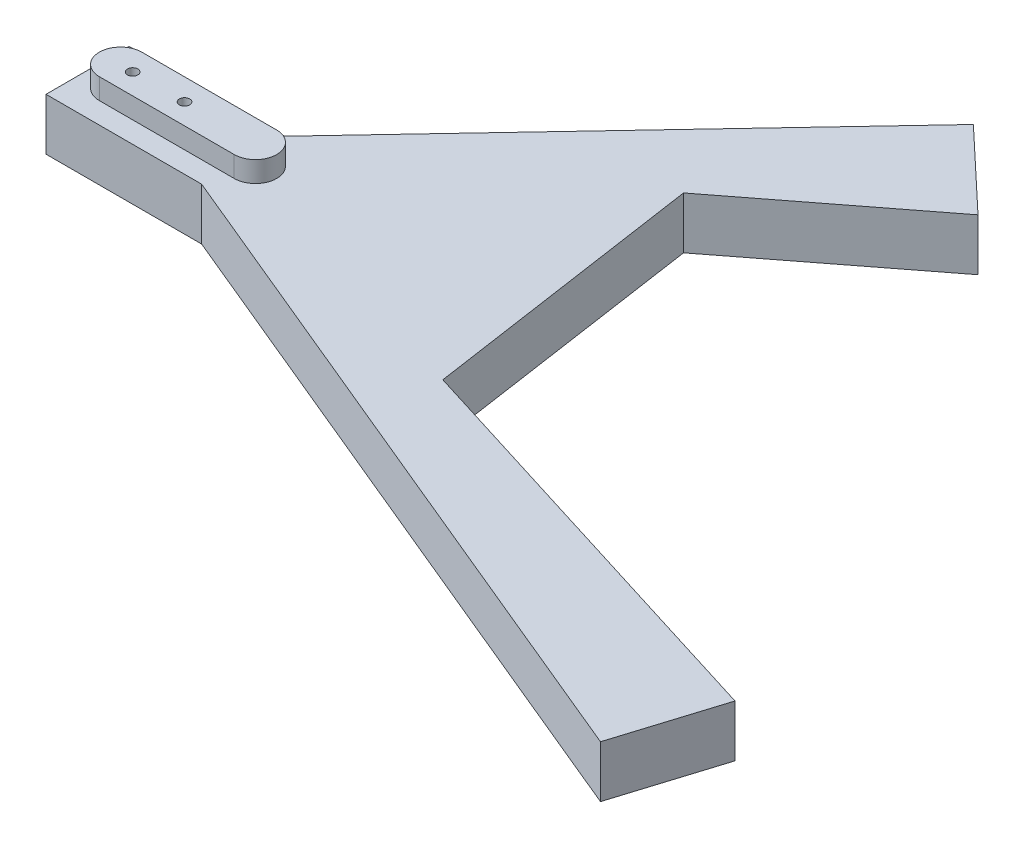
ISO-10303-21;
HEADER;
FILE_DESCRIPTION(('STEP AP214'),'2;1');
FILE_NAME('part.step','',(''),(''),'','','');
FILE_SCHEMA(('AUTOMOTIVE_DESIGN { 1 0 10303 214 1 1 1 1 }'));
ENDSEC;
DATA;
#1=APPLICATION_CONTEXT('core data for automotive mechanical design processes');
#2=APPLICATION_PROTOCOL_DEFINITION('international standard','automotive_design',2000,#1);
#3=PRODUCT_CONTEXT('',#1,'mechanical');
#4=PRODUCT('Part','Part','',(#3));
#5=PRODUCT_RELATED_PRODUCT_CATEGORY('part','',(#4));
#6=PRODUCT_DEFINITION_FORMATION('','',#4);
#7=PRODUCT_DEFINITION_CONTEXT('part definition',#1,'design');
#8=PRODUCT_DEFINITION('design','',#6,#7);
#9=PRODUCT_DEFINITION_SHAPE('','',#8);
#10=(LENGTH_UNIT() NAMED_UNIT(*) SI_UNIT(.MILLI.,.METRE.));
#11=(NAMED_UNIT(*) PLANE_ANGLE_UNIT() SI_UNIT($,.RADIAN.));
#12=(NAMED_UNIT(*) SI_UNIT($,.STERADIAN.) SOLID_ANGLE_UNIT());
#13=UNCERTAINTY_MEASURE_WITH_UNIT(LENGTH_MEASURE(1.E-05),#10,'distance_accuracy_value','');
#14=(GEOMETRIC_REPRESENTATION_CONTEXT(3) GLOBAL_UNCERTAINTY_ASSIGNED_CONTEXT((#13)) GLOBAL_UNIT_ASSIGNED_CONTEXT((#10,
#11,#12)) REPRESENTATION_CONTEXT('',''));
#15=CARTESIAN_POINT('',(0.,0.,0.));
#16=DIRECTION('',(0.,0.,1.));
#17=DIRECTION('',(1.,0.,0.));
#18=AXIS2_PLACEMENT_3D('',#15,#16,#17);
#19=CARTESIAN_POINT('',(0.,10.,0.));
#20=DIRECTION('',(0.,1.,0.));
#21=DIRECTION('',(0.,0.,1.));
#22=AXIS2_PLACEMENT_3D('',#19,#20,#21);
#23=PLANE('',#22);
#24=DIRECTION('',(0.954773464442908,0.,0.297334208586377));
#25=VECTOR('',#24,1.);
#26=CARTESIAN_POINT('',(0.710856374449116,10.,-2.28263948027003));
#27=LINE('',#26,#25);
#28=CARTESIAN_POINT('',(75.0843079370075,10.,20.878636135086));
#29=VERTEX_POINT('',#28);
#30=CARTESIAN_POINT('',(156.848103064874,10.,46.3414021426729));
#31=VERTEX_POINT('',#30);
#32=EDGE_CURVE('E208',#29,#31,#27,.T.);
#33=ORIENTED_EDGE('',*,*,#32,.F.);
#34=DIRECTION('',(0.14537864482712,0.,0.989376091093892));
#35=VECTOR('',#34,1.);
#36=CARTESIAN_POINT('',(70.4943438217605,10.,-10.358419073432));
#37=LINE('',#36,#35);
#38=CARTESIAN_POINT('',(67.0936992260433,10.,-33.5015461902879));
#39=VERTEX_POINT('',#38);
#40=EDGE_CURVE('E249',#39,#29,#37,.T.);
#41=ORIENTED_EDGE('',*,*,#40,.F.);
#42=DIRECTION('',(-0.791638832597756,0.,0.610989327830905));
#43=VECTOR('',#42,1.);
#44=CARTESIAN_POINT('',(8.84248761533747,10.,11.4569211837415));
#45=LINE('',#44,#43);
#46=CARTESIAN_POINT('',(99.1264397449868,10.,-58.2245155449201));
#47=VERTEX_POINT('',#46);
#48=EDGE_CURVE('E233',#47,#39,#45,.T.);
#49=ORIENTED_EDGE('',*,*,#48,.F.);
#50=DIRECTION('',(0.727687079160395,0.,0.685909261362619));
#51=VECTOR('',#50,1.);
#52=CARTESIAN_POINT('',(75.6976119094066,10.,-80.3082524361075));
#53=LINE('',#52,#51);
#54=CARTESIAN_POINT('',(83.5983650368064,10.,-72.8610956883529));
#55=VERTEX_POINT('',#54);
#56=EDGE_CURVE('E246',#55,#47,#53,.T.);
#57=ORIENTED_EDGE('',*,*,#56,.F.);
#58=DIRECTION('',(0.685909261362619,0.,-0.727687079160395));
#59=VECTOR('',#58,1.);
#60=CARTESIAN_POINT('',(7.90075312739979,10.,7.44715674775463));
#61=LINE('',#60,#59);
#62=CARTESIAN_POINT('',(19.188679245283,10.,-4.52830188679245));
#63=VERTEX_POINT('',#62);
#64=EDGE_CURVE('E254',#63,#55,#61,.T.);
#65=ORIENTED_EDGE('',*,*,#64,.F.);
#66=DIRECTION('',(1.,0.,0.));
#67=VECTOR('',#66,1.);
#68=CARTESIAN_POINT('',(0.,10.,-4.52830188679245));
#69=LINE('',#68,#67);
#70=CARTESIAN_POINT('',(-10.811320754717,10.,-4.52830188679245));
#71=VERTEX_POINT('',#70);
#72=EDGE_CURVE('E261',#71,#63,#69,.T.);
#73=ORIENTED_EDGE('',*,*,#72,.F.);
#74=DIRECTION('',(0.,0.,1.));
#75=VECTOR('',#74,1.);
#76=CARTESIAN_POINT('',(-10.811320754717,10.,0.));
#77=LINE('',#76,#75);
#78=CARTESIAN_POINT('',(-10.811320754717,10.,11.4716981132075));
#79=VERTEX_POINT('',#78);
#80=EDGE_CURVE('E146',#71,#79,#77,.T.);
#81=ORIENTED_EDGE('',*,*,#80,.T.);
#82=DIRECTION('',(1.,0.,0.));
#83=VECTOR('',#82,1.);
#84=CARTESIAN_POINT('',(0.,10.,11.4716981132075));
#85=LINE('',#84,#83);
#86=CARTESIAN_POINT('',(19.188679245283,10.,11.4716981132075));
#87=VERTEX_POINT('',#86);
#88=EDGE_CURVE('E138',#79,#87,#85,.T.);
#89=ORIENTED_EDGE('',*,*,#88,.T.);
#90=DIRECTION('',(-0.923472145357578,0.,-0.383665475054339));
#91=VECTOR('',#90,1.);
#92=CARTESIAN_POINT('',(-1.2399147084948,10.,2.98444027509104));
#93=LINE('',#92,#91);
#94=CARTESIAN_POINT('',(150.692912317777,10.,66.1064094112714));
#95=VERTEX_POINT('',#94);
#96=EDGE_CURVE('E143',#95,#87,#93,.T.);
#97=ORIENTED_EDGE('',*,*,#96,.F.);
#98=DIRECTION('',(-0.297334208586377,0.,0.954773464442908));
#99=VECTOR('',#98,1.);
#100=CARTESIAN_POINT('',(156.137246690425,10.,48.6240416229429));
#101=LINE('',#100,#99);
#102=EDGE_CURVE('E166',#31,#95,#101,.T.);
#103=ORIENTED_EDGE('',*,*,#102,.F.);
#104=EDGE_LOOP('',(#33,#41,#49,#57,#65,#73,#81,#89,#97,#103));
#105=FACE_BOUND('',#104,.T.);
#106=DIRECTION('',(1.,0.,0.));
#107=VECTOR('',#106,1.);
#108=CARTESIAN_POINT('',(-4.61642475908026,10.,7.38842234955546));
#109=LINE('',#108,#107);
#110=CARTESIAN_POINT('',(-4.61642475908026,10.,7.38842234955546));
#111=VERTEX_POINT('',#110);
#112=CARTESIAN_POINT('',(21.3835752409197,10.,7.38842234955546));
#113=VERTEX_POINT('',#112);
#114=EDGE_CURVE('E418',#111,#113,#109,.T.);
#115=ORIENTED_EDGE('',*,*,#114,.F.);
#116=CARTESIAN_POINT('',(-4.61642475908026,10.,3.29439885408224));
#117=DIRECTION('',(0.,1.,0.));
#118=DIRECTION('',(0.,0.,1.));
#119=AXIS2_PLACEMENT_3D('',#116,#117,#118);
#120=CIRCLE('',#119,4.09402349547322);
#121=CARTESIAN_POINT('',(-4.61642475908026,10.,-0.799624641390979));
#122=VERTEX_POINT('',#121);
#123=EDGE_CURVE('E412',#122,#111,#120,.T.);
#124=ORIENTED_EDGE('',*,*,#123,.F.);
#125=DIRECTION('',(-1.,0.,0.));
#126=VECTOR('',#125,1.);
#127=CARTESIAN_POINT('',(-4.61642475908026,10.,-0.799624641390979));
#128=LINE('',#127,#126);
#129=CARTESIAN_POINT('',(21.3835752409197,10.,-0.799624641390979));
#130=VERTEX_POINT('',#129);
#131=EDGE_CURVE('E429',#130,#122,#128,.T.);
#132=ORIENTED_EDGE('',*,*,#131,.F.);
#133=CARTESIAN_POINT('',(21.3835752409197,10.,3.29439885408224));
#134=DIRECTION('',(0.,1.,0.));
#135=DIRECTION('',(0.,0.,1.));
#136=AXIS2_PLACEMENT_3D('',#133,#134,#135);
#137=CIRCLE('',#136,4.09402349547322);
#138=EDGE_CURVE('E445',#113,#130,#137,.T.);
#139=ORIENTED_EDGE('',*,*,#138,.F.);
#140=EDGE_LOOP('',(#115,#124,#132,#139));
#141=FACE_BOUND('',#140,.T.);
#142=ADVANCED_FACE('F47',(#105,#141),#23,.T.);
#143=CARTESIAN_POINT('',(0.710856374449116,10.,-2.28263948027003));
#144=DIRECTION('',(0.297334208586377,0.,-0.954773464442908));
#145=DIRECTION('',(-0.954773464442908,0.,-0.297334208586377));
#146=AXIS2_PLACEMENT_3D('',#143,#144,#145);
#147=PLANE('',#146);
#148=DIRECTION('',(0.954773464442908,0.,0.297334208586377));
#149=VECTOR('',#148,1.);
#150=CARTESIAN_POINT('',(0.710856374449116,0.,-2.28263948027003));
#151=LINE('',#150,#149);
#152=CARTESIAN_POINT('',(75.0843079370075,0.,20.878636135086));
#153=VERTEX_POINT('',#152);
#154=CARTESIAN_POINT('',(156.848103064874,0.,46.3414021426729));
#155=VERTEX_POINT('',#154);
#156=EDGE_CURVE('E172',#153,#155,#151,.T.);
#157=ORIENTED_EDGE('',*,*,#156,.F.);
#158=DIRECTION('',(0.,-1.,0.));
#159=VECTOR('',#158,1.);
#160=CARTESIAN_POINT('',(75.0843079370075,10.,20.878636135086));
#161=LINE('',#160,#159);
#162=EDGE_CURVE('E11',#29,#153,#161,.T.);
#163=ORIENTED_EDGE('',*,*,#162,.F.);
#164=ORIENTED_EDGE('',*,*,#32,.T.);
#165=DIRECTION('',(0.,-1.,0.));
#166=VECTOR('',#165,1.);
#167=CARTESIAN_POINT('',(156.848103064874,10.,46.3414021426729));
#168=LINE('',#167,#166);
#169=EDGE_CURVE('E72',#31,#155,#168,.T.);
#170=ORIENTED_EDGE('',*,*,#169,.T.);
#171=EDGE_LOOP('',(#157,#163,#164,#170));
#172=FACE_BOUND('',#171,.T.);
#173=ADVANCED_FACE('F49',(#172),#147,.T.);
#174=CARTESIAN_POINT('',(70.4943438217605,10.,-10.358419073432));
#175=DIRECTION('',(0.989376091093892,0.,-0.14537864482712));
#176=DIRECTION('',(-0.14537864482712,0.,-0.989376091093892));
#177=AXIS2_PLACEMENT_3D('',#174,#175,#176);
#178=PLANE('',#177);
#179=DIRECTION('',(0.14537864482712,0.,0.989376091093892));
#180=VECTOR('',#179,1.);
#181=CARTESIAN_POINT('',(70.4943438217605,0.,-10.358419073432));
#182=LINE('',#181,#180);
#183=CARTESIAN_POINT('',(67.0936992260433,0.,-33.5015461902879));
#184=VERTEX_POINT('',#183);
#185=EDGE_CURVE('E175',#184,#153,#182,.T.);
#186=ORIENTED_EDGE('',*,*,#185,.F.);
#187=DIRECTION('',(0.,-1.,0.));
#188=VECTOR('',#187,1.);
#189=CARTESIAN_POINT('',(67.0936992260433,10.,-33.5015461902879));
#190=LINE('',#189,#188);
#191=EDGE_CURVE('E56',#39,#184,#190,.T.);
#192=ORIENTED_EDGE('',*,*,#191,.F.);
#193=ORIENTED_EDGE('',*,*,#40,.T.);
#194=ORIENTED_EDGE('',*,*,#162,.T.);
#195=EDGE_LOOP('',(#186,#192,#193,#194));
#196=FACE_BOUND('',#195,.T.);
#197=ADVANCED_FACE('F237',(#196),#178,.T.);
#198=CARTESIAN_POINT('',(8.84248761533747,10.,11.4569211837415));
#199=DIRECTION('',(0.610989327830905,0.,0.791638832597756));
#200=DIRECTION('',(0.791638832597756,0.,-0.610989327830905));
#201=AXIS2_PLACEMENT_3D('',#198,#199,#200);
#202=PLANE('',#201);
#203=DIRECTION('',(-0.791638832597756,0.,0.610989327830905));
#204=VECTOR('',#203,1.);
#205=CARTESIAN_POINT('',(8.84248761533747,0.,11.4569211837415));
#206=LINE('',#205,#204);
#207=CARTESIAN_POINT('',(99.1264397449868,0.,-58.2245155449201));
#208=VERTEX_POINT('',#207);
#209=EDGE_CURVE('E180',#208,#184,#206,.T.);
#210=ORIENTED_EDGE('',*,*,#209,.F.);
#211=DIRECTION('',(0.,-1.,0.));
#212=VECTOR('',#211,1.);
#213=CARTESIAN_POINT('',(99.1264397449868,10.,-58.2245155449201));
#214=LINE('',#213,#212);
#215=EDGE_CURVE('E224',#47,#208,#214,.T.);
#216=ORIENTED_EDGE('',*,*,#215,.F.);
#217=ORIENTED_EDGE('',*,*,#48,.T.);
#218=ORIENTED_EDGE('',*,*,#191,.T.);
#219=EDGE_LOOP('',(#210,#216,#217,#218));
#220=FACE_BOUND('',#219,.T.);
#221=ADVANCED_FACE('F231',(#220),#202,.T.);
#222=CARTESIAN_POINT('',(75.6976119094066,10.,-80.3082524361075));
#223=DIRECTION('',(0.685909261362619,0.,-0.727687079160395));
#224=DIRECTION('',(-0.727687079160395,0.,-0.685909261362619));
#225=AXIS2_PLACEMENT_3D('',#222,#223,#224);
#226=PLANE('',#225);
#227=DIRECTION('',(0.727687079160395,0.,0.685909261362619));
#228=VECTOR('',#227,1.);
#229=CARTESIAN_POINT('',(75.6976119094066,0.,-80.3082524361075));
#230=LINE('',#229,#228);
#231=CARTESIAN_POINT('',(83.5983650368064,0.,-72.8610956883529));
#232=VERTEX_POINT('',#231);
#233=EDGE_CURVE('E184',#232,#208,#230,.T.);
#234=ORIENTED_EDGE('',*,*,#233,.F.);
#235=DIRECTION('',(0.,-1.,0.));
#236=VECTOR('',#235,1.);
#237=CARTESIAN_POINT('',(83.5983650368064,10.,-72.8610956883529));
#238=LINE('',#237,#236);
#239=EDGE_CURVE('E221',#55,#232,#238,.T.);
#240=ORIENTED_EDGE('',*,*,#239,.F.);
#241=ORIENTED_EDGE('',*,*,#56,.T.);
#242=ORIENTED_EDGE('',*,*,#215,.T.);
#243=EDGE_LOOP('',(#234,#240,#241,#242));
#244=FACE_BOUND('',#243,.T.);
#245=ADVANCED_FACE('F243',(#244),#226,.T.);
#246=CARTESIAN_POINT('',(7.90075312739979,10.,7.44715674775463));
#247=DIRECTION('',(-0.727687079160395,0.,-0.685909261362619));
#248=DIRECTION('',(-0.685909261362619,0.,0.727687079160395));
#249=AXIS2_PLACEMENT_3D('',#246,#247,#248);
#250=PLANE('',#249);
#251=DIRECTION('',(0.685909261362619,0.,-0.727687079160395));
#252=VECTOR('',#251,1.);
#253=CARTESIAN_POINT('',(7.90075312739979,0.,7.44715674775463));
#254=LINE('',#253,#252);
#255=CARTESIAN_POINT('',(19.188679245283,0.,-4.52830188679245));
#256=VERTEX_POINT('',#255);
#257=EDGE_CURVE('E188',#256,#232,#254,.T.);
#258=ORIENTED_EDGE('',*,*,#257,.F.);
#259=DIRECTION('',(0.,-1.,0.));
#260=VECTOR('',#259,1.);
#261=CARTESIAN_POINT('',(19.188679245283,10.,-4.52830188679245));
#262=LINE('',#261,#260);
#263=EDGE_CURVE('E218',#63,#256,#262,.T.);
#264=ORIENTED_EDGE('',*,*,#263,.F.);
#265=ORIENTED_EDGE('',*,*,#64,.T.);
#266=ORIENTED_EDGE('',*,*,#239,.T.);
#267=EDGE_LOOP('',(#258,#264,#265,#266));
#268=FACE_BOUND('',#267,.T.);
#269=ADVANCED_FACE('F269',(#268),#250,.T.);
#270=CARTESIAN_POINT('',(0.,10.,-4.52830188679245));
#271=DIRECTION('',(0.,0.,-1.));
#272=DIRECTION('',(-1.,0.,0.));
#273=AXIS2_PLACEMENT_3D('',#270,#271,#272);
#274=PLANE('',#273);
#275=DIRECTION('',(1.,0.,0.));
#276=VECTOR('',#275,1.);
#277=CARTESIAN_POINT('',(0.,0.,-4.52830188679245));
#278=LINE('',#277,#276);
#279=CARTESIAN_POINT('',(-10.811320754717,0.,-4.52830188679245));
#280=VERTEX_POINT('',#279);
#281=EDGE_CURVE('E192',#280,#256,#278,.T.);
#282=ORIENTED_EDGE('',*,*,#281,.F.);
#283=DIRECTION('',(0.,-1.,0.));
#284=VECTOR('',#283,1.);
#285=CARTESIAN_POINT('',(-10.811320754717,10.,-4.52830188679245));
#286=LINE('',#285,#284);
#287=EDGE_CURVE('E215',#71,#280,#286,.T.);
#288=ORIENTED_EDGE('',*,*,#287,.F.);
#289=ORIENTED_EDGE('',*,*,#72,.T.);
#290=ORIENTED_EDGE('',*,*,#263,.T.);
#291=EDGE_LOOP('',(#282,#288,#289,#290));
#292=FACE_BOUND('',#291,.T.);
#293=ADVANCED_FACE('F267',(#292),#274,.T.);
#294=CARTESIAN_POINT('',(-10.811320754717,10.,0.));
#295=DIRECTION('',(1.,0.,0.));
#296=DIRECTION('',(0.,0.,-1.));
#297=AXIS2_PLACEMENT_3D('',#294,#295,#296);
#298=PLANE('',#297);
#299=DIRECTION('',(0.,0.,1.));
#300=VECTOR('',#299,1.);
#301=CARTESIAN_POINT('',(-10.811320754717,0.,0.));
#302=LINE('',#301,#300);
#303=CARTESIAN_POINT('',(-10.811320754717,0.,11.4716981132075));
#304=VERTEX_POINT('',#303);
#305=EDGE_CURVE('E196',#280,#304,#302,.T.);
#306=ORIENTED_EDGE('',*,*,#305,.T.);
#307=DIRECTION('',(0.,-1.,0.));
#308=VECTOR('',#307,1.);
#309=CARTESIAN_POINT('',(-10.811320754717,10.,11.4716981132075));
#310=LINE('',#309,#308);
#311=EDGE_CURVE('E161',#79,#304,#310,.T.);
#312=ORIENTED_EDGE('',*,*,#311,.F.);
#313=ORIENTED_EDGE('',*,*,#80,.F.);
#314=ORIENTED_EDGE('',*,*,#287,.T.);
#315=EDGE_LOOP('',(#306,#312,#313,#314));
#316=FACE_BOUND('',#315,.T.);
#317=ADVANCED_FACE('F272',(#316),#298,.F.);
#318=CARTESIAN_POINT('',(0.,10.,11.4716981132075));
#319=DIRECTION('',(0.,0.,-1.));
#320=DIRECTION('',(-1.,0.,0.));
#321=AXIS2_PLACEMENT_3D('',#318,#319,#320);
#322=PLANE('',#321);
#323=DIRECTION('',(1.,0.,0.));
#324=VECTOR('',#323,1.);
#325=CARTESIAN_POINT('',(0.,0.,11.4716981132075));
#326=LINE('',#325,#324);
#327=CARTESIAN_POINT('',(19.188679245283,0.,11.4716981132075));
#328=VERTEX_POINT('',#327);
#329=EDGE_CURVE('E156',#304,#328,#326,.T.);
#330=ORIENTED_EDGE('',*,*,#329,.T.);
#331=DIRECTION('',(0.,-1.,0.));
#332=VECTOR('',#331,1.);
#333=CARTESIAN_POINT('',(19.188679245283,10.,11.4716981132075));
#334=LINE('',#333,#332);
#335=EDGE_CURVE('E153',#87,#328,#334,.T.);
#336=ORIENTED_EDGE('',*,*,#335,.F.);
#337=ORIENTED_EDGE('',*,*,#88,.F.);
#338=ORIENTED_EDGE('',*,*,#311,.T.);
#339=EDGE_LOOP('',(#330,#336,#337,#338));
#340=FACE_BOUND('',#339,.T.);
#341=ADVANCED_FACE('F154',(#340),#322,.F.);
#342=CARTESIAN_POINT('',(-1.2399147084948,10.,2.98444027509104));
#343=DIRECTION('',(-0.383665475054339,0.,0.923472145357578));
#344=DIRECTION('',(0.923472145357578,0.,0.383665475054339));
#345=AXIS2_PLACEMENT_3D('',#342,#343,#344);
#346=PLANE('',#345);
#347=DIRECTION('',(-0.923472145357578,0.,-0.383665475054339));
#348=VECTOR('',#347,1.);
#349=CARTESIAN_POINT('',(-1.2399147084948,0.,2.98444027509104));
#350=LINE('',#349,#348);
#351=CARTESIAN_POINT('',(150.692912317777,0.,66.1064094112714));
#352=VERTEX_POINT('',#351);
#353=EDGE_CURVE('E201',#352,#328,#350,.T.);
#354=ORIENTED_EDGE('',*,*,#353,.F.);
#355=DIRECTION('',(0.,-1.,0.));
#356=VECTOR('',#355,1.);
#357=CARTESIAN_POINT('',(150.692912317777,10.,66.1064094112714));
#358=LINE('',#357,#356);
#359=EDGE_CURVE('E162',#95,#352,#358,.T.);
#360=ORIENTED_EDGE('',*,*,#359,.F.);
#361=ORIENTED_EDGE('',*,*,#96,.T.);
#362=ORIENTED_EDGE('',*,*,#335,.T.);
#363=EDGE_LOOP('',(#354,#360,#361,#362));
#364=FACE_BOUND('',#363,.T.);
#365=ADVANCED_FACE('F164',(#364),#346,.T.);
#366=CARTESIAN_POINT('',(156.137246690425,10.,48.6240416229429));
#367=DIRECTION('',(0.954773464442908,0.,0.297334208586377));
#368=DIRECTION('',(0.297334208586377,0.,-0.954773464442908));
#369=AXIS2_PLACEMENT_3D('',#366,#367,#368);
#370=PLANE('',#369);
#371=DIRECTION('',(-0.297334208586377,0.,0.954773464442908));
#372=VECTOR('',#371,1.);
#373=CARTESIAN_POINT('',(156.137246690425,0.,48.6240416229429));
#374=LINE('',#373,#372);
#375=EDGE_CURVE('E204',#155,#352,#374,.T.);
#376=ORIENTED_EDGE('',*,*,#375,.F.);
#377=ORIENTED_EDGE('',*,*,#169,.F.);
#378=ORIENTED_EDGE('',*,*,#102,.T.);
#379=ORIENTED_EDGE('',*,*,#359,.T.);
#380=EDGE_LOOP('',(#376,#377,#378,#379));
#381=FACE_BOUND('',#380,.T.);
#382=ADVANCED_FACE('F294',(#381),#370,.T.);
#383=CARTESIAN_POINT('',(0.,0.,0.));
#384=DIRECTION('',(0.,1.,0.));
#385=DIRECTION('',(0.,0.,1.));
#386=AXIS2_PLACEMENT_3D('',#383,#384,#385);
#387=PLANE('',#386);
#388=CARTESIAN_POINT('',(-2.18953581295003,0.,3.38842234955546));
#389=DIRECTION('',(0.,1.,0.));
#390=DIRECTION('',(0.,0.,1.));
#391=AXIS2_PLACEMENT_3D('',#388,#389,#390);
#392=CIRCLE('',#391,1.);
#393=CARTESIAN_POINT('',(-2.18953581295003,0.,4.38842234955546));
#394=VERTEX_POINT('',#393);
#395=EDGE_CURVE('E410',#394,#394,#392,.T.);
#396=ORIENTED_EDGE('',*,*,#395,.T.);
#397=EDGE_LOOP('',(#396));
#398=FACE_BOUND('',#397,.T.);
#399=CARTESIAN_POINT('',(7.81046418704997,0.,3.39416898825803));
#400=DIRECTION('',(0.,1.,0.));
#401=DIRECTION('',(0.,0.,1.));
#402=AXIS2_PLACEMENT_3D('',#399,#400,#401);
#403=CIRCLE('',#402,1.);
#404=CARTESIAN_POINT('',(7.81046418704997,0.,4.39416898825803));
#405=VERTEX_POINT('',#404);
#406=EDGE_CURVE('E413',#405,#405,#403,.T.);
#407=ORIENTED_EDGE('',*,*,#406,.T.);
#408=EDGE_LOOP('',(#407));
#409=FACE_BOUND('',#408,.T.);
#410=ORIENTED_EDGE('',*,*,#156,.T.);
#411=ORIENTED_EDGE('',*,*,#375,.T.);
#412=ORIENTED_EDGE('',*,*,#353,.T.);
#413=ORIENTED_EDGE('',*,*,#329,.F.);
#414=ORIENTED_EDGE('',*,*,#305,.F.);
#415=ORIENTED_EDGE('',*,*,#281,.T.);
#416=ORIENTED_EDGE('',*,*,#257,.T.);
#417=ORIENTED_EDGE('',*,*,#233,.T.);
#418=ORIENTED_EDGE('',*,*,#209,.T.);
#419=ORIENTED_EDGE('',*,*,#185,.T.);
#420=EDGE_LOOP('',(#410,#411,#412,#413,#414,#415,#416,#417,#418,#419));
#421=FACE_BOUND('',#420,.T.);
#422=ADVANCED_FACE('F239',(#398,#409,#421),#387,.F.);
#423=CARTESIAN_POINT('',(-4.61642475908026,14.,3.29439885408224));
#424=DIRECTION('',(0.,-1.,0.));
#425=DIRECTION('',(0.,0.,-1.));
#426=AXIS2_PLACEMENT_3D('',#423,#424,#425);
#427=CYLINDRICAL_SURFACE('',#426,4.09402349547322);
#428=ORIENTED_EDGE('',*,*,#123,.T.);
#429=DIRECTION('',(0.,-1.,0.));
#430=VECTOR('',#429,1.);
#431=CARTESIAN_POINT('',(-4.61642475908026,14.,7.38842234955546));
#432=LINE('',#431,#430);
#433=CARTESIAN_POINT('',(-4.61642475908026,14.,7.38842234955546));
#434=VERTEX_POINT('',#433);
#435=EDGE_CURVE('E176',#434,#111,#432,.T.);
#436=ORIENTED_EDGE('',*,*,#435,.F.);
#437=CARTESIAN_POINT('',(-4.61642475908026,14.,3.29439885408224));
#438=DIRECTION('',(0.,1.,0.));
#439=DIRECTION('',(0.,0.,1.));
#440=AXIS2_PLACEMENT_3D('',#437,#438,#439);
#441=CIRCLE('',#440,4.09402349547322);
#442=CARTESIAN_POINT('',(-4.61642475908026,14.,-0.799624641390979));
#443=VERTEX_POINT('',#442);
#444=EDGE_CURVE('E424',#443,#434,#441,.T.);
#445=ORIENTED_EDGE('',*,*,#444,.F.);
#446=DIRECTION('',(0.,-1.,0.));
#447=VECTOR('',#446,1.);
#448=CARTESIAN_POINT('',(-4.61642475908026,14.,-0.799624641390979));
#449=LINE('',#448,#447);
#450=EDGE_CURVE('E440',#443,#122,#449,.T.);
#451=ORIENTED_EDGE('',*,*,#450,.T.);
#452=EDGE_LOOP('',(#428,#436,#445,#451));
#453=FACE_BOUND('',#452,.T.);
#454=ADVANCED_FACE('F290',(#453),#427,.T.);
#455=CARTESIAN_POINT('',(-4.61642475908026,14.,7.38842234955546));
#456=DIRECTION('',(0.,0.,-1.));
#457=DIRECTION('',(-1.,0.,0.));
#458=AXIS2_PLACEMENT_3D('',#455,#456,#457);
#459=PLANE('',#458);
#460=ORIENTED_EDGE('',*,*,#114,.T.);
#461=DIRECTION('',(0.,-1.,0.));
#462=VECTOR('',#461,1.);
#463=CARTESIAN_POINT('',(21.3835752409197,14.,7.38842234955546));
#464=LINE('',#463,#462);
#465=CARTESIAN_POINT('',(21.3835752409197,14.,7.38842234955546));
#466=VERTEX_POINT('',#465);
#467=EDGE_CURVE('E455',#466,#113,#464,.T.);
#468=ORIENTED_EDGE('',*,*,#467,.F.);
#469=DIRECTION('',(1.,0.,0.));
#470=VECTOR('',#469,1.);
#471=CARTESIAN_POINT('',(-4.61642475908026,14.,7.38842234955546));
#472=LINE('',#471,#470);
#473=EDGE_CURVE('E428',#434,#466,#472,.T.);
#474=ORIENTED_EDGE('',*,*,#473,.F.);
#475=ORIENTED_EDGE('',*,*,#435,.T.);
#476=EDGE_LOOP('',(#460,#468,#474,#475));
#477=FACE_BOUND('',#476,.T.);
#478=ADVANCED_FACE('F346',(#477),#459,.F.);
#479=CARTESIAN_POINT('',(21.3835752409197,14.,3.29439885408224));
#480=DIRECTION('',(0.,-1.,0.));
#481=DIRECTION('',(0.,0.,-1.));
#482=AXIS2_PLACEMENT_3D('',#479,#480,#481);
#483=CYLINDRICAL_SURFACE('',#482,4.09402349547322);
#484=ORIENTED_EDGE('',*,*,#138,.T.);
#485=DIRECTION('',(0.,-1.,0.));
#486=VECTOR('',#485,1.);
#487=CARTESIAN_POINT('',(21.3835752409197,14.,-0.799624641390979));
#488=LINE('',#487,#486);
#489=CARTESIAN_POINT('',(21.3835752409197,14.,-0.799624641390979));
#490=VERTEX_POINT('',#489);
#491=EDGE_CURVE('E63',#490,#130,#488,.T.);
#492=ORIENTED_EDGE('',*,*,#491,.F.);
#493=CARTESIAN_POINT('',(21.3835752409197,14.,3.29439885408224));
#494=DIRECTION('',(0.,1.,0.));
#495=DIRECTION('',(0.,0.,1.));
#496=AXIS2_PLACEMENT_3D('',#493,#494,#495);
#497=CIRCLE('',#496,4.09402349547322);
#498=EDGE_CURVE('E433',#466,#490,#497,.T.);
#499=ORIENTED_EDGE('',*,*,#498,.F.);
#500=ORIENTED_EDGE('',*,*,#467,.T.);
#501=EDGE_LOOP('',(#484,#492,#499,#500));
#502=FACE_BOUND('',#501,.T.);
#503=ADVANCED_FACE('F355',(#502),#483,.T.);
#504=CARTESIAN_POINT('',(-4.61642475908026,14.,-0.799624641390979));
#505=DIRECTION('',(0.,0.,1.));
#506=DIRECTION('',(1.,0.,0.));
#507=AXIS2_PLACEMENT_3D('',#504,#505,#506);
#508=PLANE('',#507);
#509=ORIENTED_EDGE('',*,*,#131,.T.);
#510=ORIENTED_EDGE('',*,*,#450,.F.);
#511=DIRECTION('',(-1.,0.,0.));
#512=VECTOR('',#511,1.);
#513=CARTESIAN_POINT('',(-4.61642475908026,14.,-0.799624641390979));
#514=LINE('',#513,#512);
#515=EDGE_CURVE('E437',#490,#443,#514,.T.);
#516=ORIENTED_EDGE('',*,*,#515,.F.);
#517=ORIENTED_EDGE('',*,*,#491,.T.);
#518=EDGE_LOOP('',(#509,#510,#516,#517));
#519=FACE_BOUND('',#518,.T.);
#520=ADVANCED_FACE('F364',(#519),#508,.F.);
#521=CARTESIAN_POINT('',(-4.61642475908026,14.,3.29439885408224));
#522=DIRECTION('',(0.,1.,0.));
#523=DIRECTION('',(0.,0.,1.));
#524=AXIS2_PLACEMENT_3D('',#521,#522,#523);
#525=PLANE('',#524);
#526=CARTESIAN_POINT('',(-2.18953581295003,14.,3.38842234955546));
#527=DIRECTION('',(0.,1.,0.));
#528=DIRECTION('',(0.,0.,1.));
#529=AXIS2_PLACEMENT_3D('',#526,#527,#528);
#530=CIRCLE('',#529,1.);
#531=CARTESIAN_POINT('',(-2.18953581295003,14.,4.38842234955546));
#532=VERTEX_POINT('',#531);
#533=EDGE_CURVE('E407',#532,#532,#530,.T.);
#534=ORIENTED_EDGE('',*,*,#533,.F.);
#535=EDGE_LOOP('',(#534));
#536=FACE_BOUND('',#535,.T.);
#537=CARTESIAN_POINT('',(7.81046418704997,14.,3.39416898825803));
#538=DIRECTION('',(0.,1.,0.));
#539=DIRECTION('',(0.,0.,1.));
#540=AXIS2_PLACEMENT_3D('',#537,#538,#539);
#541=CIRCLE('',#540,1.);
#542=CARTESIAN_POINT('',(7.81046418704997,14.,4.39416898825803));
#543=VERTEX_POINT('',#542);
#544=EDGE_CURVE('E483',#543,#543,#541,.T.);
#545=ORIENTED_EDGE('',*,*,#544,.F.);
#546=EDGE_LOOP('',(#545));
#547=FACE_BOUND('',#546,.T.);
#548=ORIENTED_EDGE('',*,*,#444,.T.);
#549=ORIENTED_EDGE('',*,*,#473,.T.);
#550=ORIENTED_EDGE('',*,*,#498,.T.);
#551=ORIENTED_EDGE('',*,*,#515,.T.);
#552=EDGE_LOOP('',(#548,#549,#550,#551));
#553=FACE_BOUND('',#552,.T.);
#554=ADVANCED_FACE('F373',(#536,#547,#553),#525,.T.);
#555=CARTESIAN_POINT('',(7.81046418704997,-6.,3.39416898825803));
#556=DIRECTION('',(0.,1.,0.));
#557=DIRECTION('',(0.,0.,1.));
#558=AXIS2_PLACEMENT_3D('',#555,#556,#557);
#559=CYLINDRICAL_SURFACE('',#558,1.);
#560=ORIENTED_EDGE('',*,*,#544,.T.);
#561=EDGE_LOOP('',(#560));
#562=FACE_BOUND('',#561,.T.);
#563=ORIENTED_EDGE('',*,*,#406,.F.);
#564=EDGE_LOOP('',(#563));
#565=FACE_BOUND('',#564,.T.);
#566=ADVANCED_FACE('F381',(#562,#565),#559,.F.);
#567=CARTESIAN_POINT('',(-2.18953581295003,-6.,3.38842234955546));
#568=DIRECTION('',(0.,1.,0.));
#569=DIRECTION('',(0.,0.,1.));
#570=AXIS2_PLACEMENT_3D('',#567,#568,#569);
#571=CYLINDRICAL_SURFACE('',#570,1.);
#572=ORIENTED_EDGE('',*,*,#533,.T.);
#573=EDGE_LOOP('',(#572));
#574=FACE_BOUND('',#573,.T.);
#575=ORIENTED_EDGE('',*,*,#395,.F.);
#576=EDGE_LOOP('',(#575));
#577=FACE_BOUND('',#576,.T.);
#578=ADVANCED_FACE('F391',(#574,#577),#571,.F.);
#579=CLOSED_SHELL('',(#142,#173,#197,#221,#245,#269,#293,#317,#341,#365,#382,#422,#454,#478,
#503,#520,#554,#566,#578));
#580=MANIFOLD_SOLID_BREP('B2',#579);
#581=ADVANCED_BREP_SHAPE_REPRESENTATION('',(#18,#580),#14);
#582=SHAPE_DEFINITION_REPRESENTATION(#9,#581);
ENDSEC;
END-ISO-10303-21;
